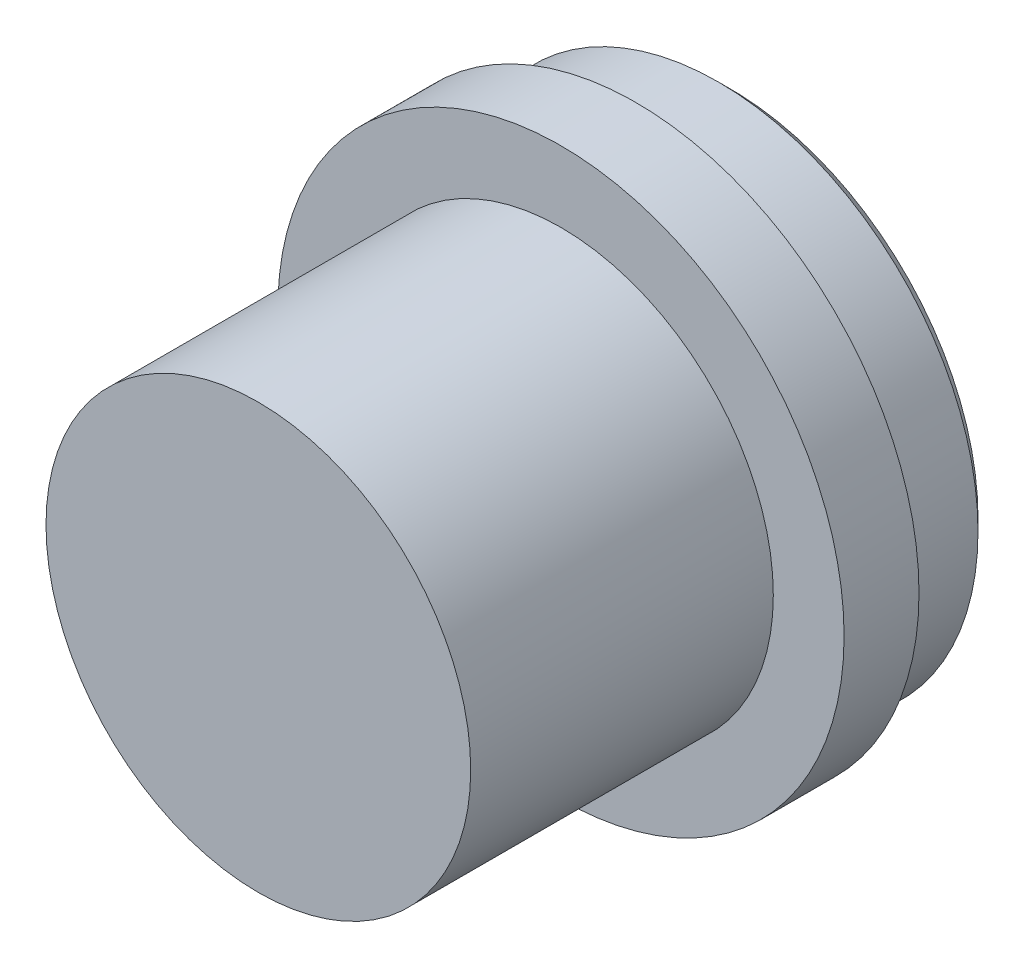
ISO-10303-21;
HEADER;
FILE_DESCRIPTION(('STEP AP214'),'2;1');
FILE_NAME('part.step','',(''),(''),'','','');
FILE_SCHEMA(('AUTOMOTIVE_DESIGN { 1 0 10303 214 1 1 1 1 }'));
ENDSEC;
DATA;
#1=APPLICATION_CONTEXT('core data for automotive mechanical design processes');
#2=APPLICATION_PROTOCOL_DEFINITION('international standard','automotive_design',2000,#1);
#3=PRODUCT_CONTEXT('',#1,'mechanical');
#4=PRODUCT('Part','Part','',(#3));
#5=PRODUCT_RELATED_PRODUCT_CATEGORY('part','',(#4));
#6=PRODUCT_DEFINITION_FORMATION('','',#4);
#7=PRODUCT_DEFINITION_CONTEXT('part definition',#1,'design');
#8=PRODUCT_DEFINITION('design','',#6,#7);
#9=PRODUCT_DEFINITION_SHAPE('','',#8);
#10=(LENGTH_UNIT() NAMED_UNIT(*) SI_UNIT(.MILLI.,.METRE.));
#11=(NAMED_UNIT(*) PLANE_ANGLE_UNIT() SI_UNIT($,.RADIAN.));
#12=(NAMED_UNIT(*) SI_UNIT($,.STERADIAN.) SOLID_ANGLE_UNIT());
#13=UNCERTAINTY_MEASURE_WITH_UNIT(LENGTH_MEASURE(1.E-05),#10,'distance_accuracy_value','');
#14=(GEOMETRIC_REPRESENTATION_CONTEXT(3) GLOBAL_UNCERTAINTY_ASSIGNED_CONTEXT((#13)) GLOBAL_UNIT_ASSIGNED_CONTEXT((#10,
#11,#12)) REPRESENTATION_CONTEXT('',''));
#15=CARTESIAN_POINT('',(0.,0.,0.));
#16=DIRECTION('',(0.,0.,1.));
#17=DIRECTION('',(1.,0.,0.));
#18=AXIS2_PLACEMENT_3D('',#15,#16,#17);
#19=CARTESIAN_POINT('',(0.,0.,20.));
#20=DIRECTION('',(0.,0.,1.));
#21=DIRECTION('',(1.,0.,0.));
#22=AXIS2_PLACEMENT_3D('',#19,#20,#21);
#23=CYLINDRICAL_SURFACE('',#22,9.);
#24=CARTESIAN_POINT('',(0.,0.,7.175));
#25=DIRECTION('',(0.,0.,1.));
#26=DIRECTION('',(1.,0.,0.));
#27=AXIS2_PLACEMENT_3D('',#24,#25,#26);
#28=CIRCLE('',#27,9.);
#29=CARTESIAN_POINT('',(9.,0.,7.175));
#30=VERTEX_POINT('',#29);
#31=EDGE_CURVE('E62',#30,#30,#28,.T.);
#32=ORIENTED_EDGE('',*,*,#31,.T.);
#33=EDGE_LOOP('',(#32));
#34=FACE_BOUND('',#33,.T.);
#35=CARTESIAN_POINT('',(0.,0.,20.));
#36=DIRECTION('',(0.,0.,1.));
#37=DIRECTION('',(1.,0.,0.));
#38=AXIS2_PLACEMENT_3D('',#35,#36,#37);
#39=CIRCLE('',#38,9.);
#40=CARTESIAN_POINT('',(9.,0.,20.));
#41=VERTEX_POINT('',#40);
#42=EDGE_CURVE('E47',#41,#41,#39,.T.);
#43=ORIENTED_EDGE('',*,*,#42,.F.);
#44=EDGE_LOOP('',(#43));
#45=FACE_BOUND('',#44,.T.);
#46=ADVANCED_FACE('F35',(#34,#45),#23,.T.);
#47=CARTESIAN_POINT('',(9.,0.,20.));
#48=DIRECTION('',(0.,0.,1.));
#49=DIRECTION('',(1.,0.,0.));
#50=AXIS2_PLACEMENT_3D('',#47,#48,#49);
#51=PLANE('',#50);
#52=ORIENTED_EDGE('',*,*,#42,.T.);
#53=EDGE_LOOP('',(#52));
#54=FACE_BOUND('',#53,.T.);
#55=ADVANCED_FACE('F82',(#54),#51,.T.);
#56=CARTESIAN_POINT('',(0.,0.,0.));
#57=DIRECTION('',(0.,0.,-1.));
#58=DIRECTION('',(-1.,0.,0.));
#59=AXIS2_PLACEMENT_3D('',#56,#57,#58);
#60=PLANE('',#59);
#61=CARTESIAN_POINT('',(0.,0.,0.));
#62=DIRECTION('',(0.,0.,-1.));
#63=DIRECTION('',(-1.,0.,0.));
#64=AXIS2_PLACEMENT_3D('',#61,#62,#63);
#65=CIRCLE('',#64,10.5);
#66=CARTESIAN_POINT('',(-10.5,0.,0.));
#67=VERTEX_POINT('',#66);
#68=EDGE_CURVE('E10',#67,#67,#65,.T.);
#69=ORIENTED_EDGE('',*,*,#68,.T.);
#70=EDGE_LOOP('',(#69));
#71=FACE_BOUND('',#70,.T.);
#72=ADVANCED_FACE('F86',(#71),#60,.T.);
#73=CARTESIAN_POINT('',(0.,0.,20.));
#74=DIRECTION('',(0.,0.,1.));
#75=DIRECTION('',(1.,0.,0.));
#76=AXIS2_PLACEMENT_3D('',#73,#74,#75);
#77=CYLINDRICAL_SURFACE('',#76,11.);
#78=CARTESIAN_POINT('',(0.,0.,0.499999999999997));
#79=DIRECTION('',(0.,0.,-1.));
#80=DIRECTION('',(-1.,0.,0.));
#81=AXIS2_PLACEMENT_3D('',#78,#79,#80);
#82=CIRCLE('',#81,11.);
#83=CARTESIAN_POINT('',(-11.,0.,0.499999999999997));
#84=VERTEX_POINT('',#83);
#85=EDGE_CURVE('E43',#84,#84,#82,.F.);
#86=ORIENTED_EDGE('',*,*,#85,.T.);
#87=EDGE_LOOP('',(#86));
#88=FACE_BOUND('',#87,.T.);
#89=CARTESIAN_POINT('',(0.,0.,4.));
#90=DIRECTION('',(0.,0.,1.));
#91=DIRECTION('',(1.,0.,0.));
#92=AXIS2_PLACEMENT_3D('',#89,#90,#91);
#93=CIRCLE('',#92,11.);
#94=CARTESIAN_POINT('',(11.,0.,4.));
#95=VERTEX_POINT('',#94);
#96=EDGE_CURVE('E51',#95,#95,#93,.T.);
#97=ORIENTED_EDGE('',*,*,#96,.F.);
#98=EDGE_LOOP('',(#97));
#99=FACE_BOUND('',#98,.T.);
#100=ADVANCED_FACE('F92',(#88,#99),#77,.T.);
#101=CARTESIAN_POINT('',(11.,0.,4.));
#102=DIRECTION('',(0.,0.,-1.));
#103=DIRECTION('',(-1.,0.,0.));
#104=AXIS2_PLACEMENT_3D('',#101,#102,#103);
#105=PLANE('',#104);
#106=ORIENTED_EDGE('',*,*,#96,.T.);
#107=EDGE_LOOP('',(#106));
#108=FACE_BOUND('',#107,.T.);
#109=CARTESIAN_POINT('',(0.,0.,4.));
#110=DIRECTION('',(0.,0.,1.));
#111=DIRECTION('',(1.,0.,0.));
#112=AXIS2_PLACEMENT_3D('',#109,#110,#111);
#113=CIRCLE('',#112,12.);
#114=CARTESIAN_POINT('',(12.,0.,4.));
#115=VERTEX_POINT('',#114);
#116=EDGE_CURVE('E56',#115,#115,#113,.T.);
#117=ORIENTED_EDGE('',*,*,#116,.F.);
#118=EDGE_LOOP('',(#117));
#119=FACE_BOUND('',#118,.T.);
#120=ADVANCED_FACE('F78',(#108,#119),#105,.T.);
#121=CARTESIAN_POINT('',(0.,0.,20.));
#122=DIRECTION('',(0.,0.,1.));
#123=DIRECTION('',(1.,0.,0.));
#124=AXIS2_PLACEMENT_3D('',#121,#122,#123);
#125=CYLINDRICAL_SURFACE('',#124,12.);
#126=ORIENTED_EDGE('',*,*,#116,.T.);
#127=EDGE_LOOP('',(#126));
#128=FACE_BOUND('',#127,.T.);
#129=CARTESIAN_POINT('',(0.,0.,7.175));
#130=DIRECTION('',(0.,0.,1.));
#131=DIRECTION('',(1.,0.,0.));
#132=AXIS2_PLACEMENT_3D('',#129,#130,#131);
#133=CIRCLE('',#132,12.);
#134=CARTESIAN_POINT('',(12.,0.,7.175));
#135=VERTEX_POINT('',#134);
#136=EDGE_CURVE('E59',#135,#135,#133,.T.);
#137=ORIENTED_EDGE('',*,*,#136,.F.);
#138=EDGE_LOOP('',(#137));
#139=FACE_BOUND('',#138,.T.);
#140=ADVANCED_FACE('F70',(#128,#139),#125,.T.);
#141=CARTESIAN_POINT('',(12.,0.,7.175));
#142=DIRECTION('',(0.,0.,1.));
#143=DIRECTION('',(1.,0.,0.));
#144=AXIS2_PLACEMENT_3D('',#141,#142,#143);
#145=PLANE('',#144);
#146=ORIENTED_EDGE('',*,*,#136,.T.);
#147=EDGE_LOOP('',(#146));
#148=FACE_BOUND('',#147,.T.);
#149=ORIENTED_EDGE('',*,*,#31,.F.);
#150=EDGE_LOOP('',(#149));
#151=FACE_BOUND('',#150,.T.);
#152=ADVANCED_FACE('F68',(#148,#151),#145,.T.);
#153=CARTESIAN_POINT('',(0.,0.,0.499999999999997));
#154=DIRECTION('',(0.,0.,1.));
#155=DIRECTION('',(1.,0.,0.));
#156=AXIS2_PLACEMENT_3D('',#153,#154,#155);
#157=CONICAL_SURFACE('',#156,11.,0.785398163397452);
#158=ORIENTED_EDGE('',*,*,#68,.F.);
#159=EDGE_LOOP('',(#158));
#160=FACE_BOUND('',#159,.T.);
#161=ORIENTED_EDGE('',*,*,#85,.F.);
#162=EDGE_LOOP('',(#161));
#163=FACE_BOUND('',#162,.T.);
#164=ADVANCED_FACE('F38',(#160,#163),#157,.T.);
#165=CLOSED_SHELL('',(#46,#55,#72,#100,#120,#140,#152,#164));
#166=MANIFOLD_SOLID_BREP('B2',#165);
#167=ADVANCED_BREP_SHAPE_REPRESENTATION('',(#18,#166),#14);
#168=SHAPE_DEFINITION_REPRESENTATION(#9,#167);
ENDSEC;
END-ISO-10303-21;
